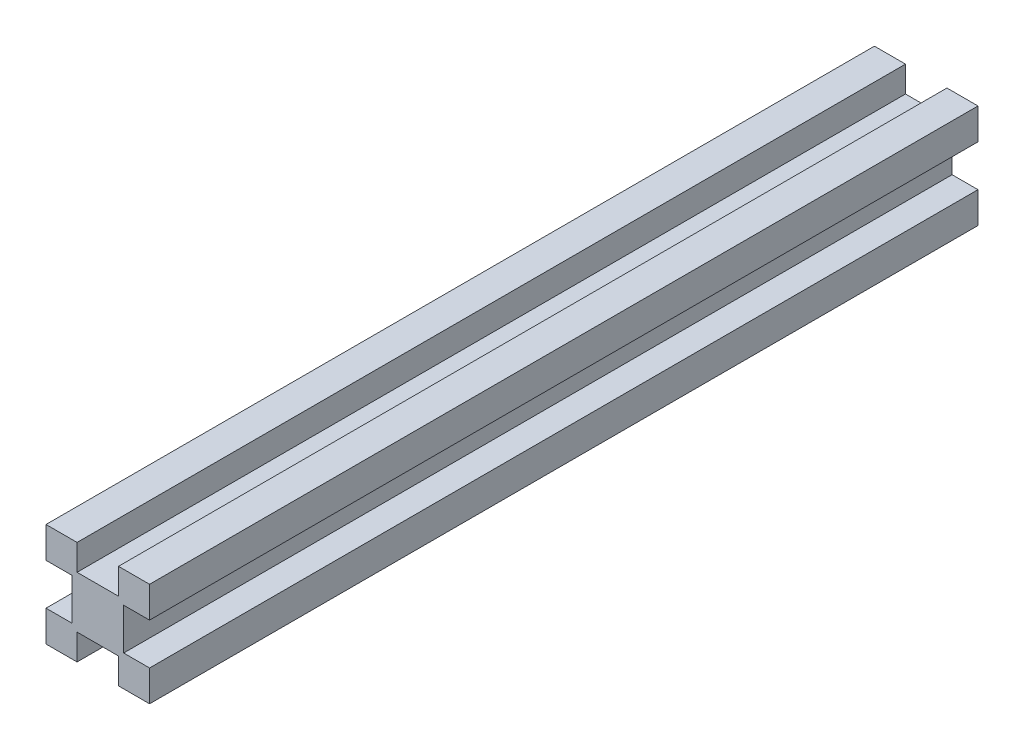
ISO-10303-21;
HEADER;
FILE_DESCRIPTION(('STEP AP214'),'2;1');
FILE_NAME('part.step','',(''),(''),'','','');
FILE_SCHEMA(('AUTOMOTIVE_DESIGN { 1 0 10303 214 1 1 1 1 }'));
ENDSEC;
DATA;
#1=APPLICATION_CONTEXT('core data for automotive mechanical design processes');
#2=APPLICATION_PROTOCOL_DEFINITION('international standard','automotive_design',2000,#1);
#3=PRODUCT_CONTEXT('',#1,'mechanical');
#4=PRODUCT('Part','Part','',(#3));
#5=PRODUCT_RELATED_PRODUCT_CATEGORY('part','',(#4));
#6=PRODUCT_DEFINITION_FORMATION('','',#4);
#7=PRODUCT_DEFINITION_CONTEXT('part definition',#1,'design');
#8=PRODUCT_DEFINITION('design','',#6,#7);
#9=PRODUCT_DEFINITION_SHAPE('','',#8);
#10=(LENGTH_UNIT() NAMED_UNIT(*) SI_UNIT(.MILLI.,.METRE.));
#11=(NAMED_UNIT(*) PLANE_ANGLE_UNIT() SI_UNIT($,.RADIAN.));
#12=(NAMED_UNIT(*) SI_UNIT($,.STERADIAN.) SOLID_ANGLE_UNIT());
#13=UNCERTAINTY_MEASURE_WITH_UNIT(LENGTH_MEASURE(1.E-05),#10,'distance_accuracy_value','');
#14=(GEOMETRIC_REPRESENTATION_CONTEXT(3) GLOBAL_UNCERTAINTY_ASSIGNED_CONTEXT((#13)) GLOBAL_UNIT_ASSIGNED_CONTEXT((#10,
#11,#12)) REPRESENTATION_CONTEXT('',''));
#15=CARTESIAN_POINT('',(0.,0.,0.));
#16=DIRECTION('',(0.,0.,1.));
#17=DIRECTION('',(1.,0.,0.));
#18=AXIS2_PLACEMENT_3D('',#15,#16,#17);
#19=CARTESIAN_POINT('',(-3.5325550493546,14.5416666666667,160.));
#20=DIRECTION('',(-1.,0.,0.));
#21=DIRECTION('',(0.,-1.,0.));
#22=AXIS2_PLACEMENT_3D('',#19,#20,#21);
#23=PLANE('',#22);
#24=DIRECTION('',(0.,1.,0.));
#25=VECTOR('',#24,1.);
#26=CARTESIAN_POINT('',(-3.5325550493546,14.5416666666667,0.));
#27=LINE('',#26,#25);
#28=CARTESIAN_POINT('',(-3.5325550493546,-5.45833333333333,0.));
#29=VERTEX_POINT('',#28);
#30=CARTESIAN_POINT('',(-3.5325550493546,0.541666666666671,0.));
#31=VERTEX_POINT('',#30);
#32=EDGE_CURVE('E226',#29,#31,#27,.T.);
#33=ORIENTED_EDGE('',*,*,#32,.T.);
#34=DIRECTION('',(0.,0.,1.));
#35=VECTOR('',#34,1.);
#36=CARTESIAN_POINT('',(-3.5325550493546,0.541666666666671,-160.));
#37=LINE('',#36,#35);
#38=CARTESIAN_POINT('',(-3.5325550493546,0.541666666666671,160.));
#39=VERTEX_POINT('',#38);
#40=EDGE_CURVE('E350',#31,#39,#37,.T.);
#41=ORIENTED_EDGE('',*,*,#40,.T.);
#42=DIRECTION('',(0.,1.,0.));
#43=VECTOR('',#42,1.);
#44=CARTESIAN_POINT('',(-3.5325550493546,14.5416666666667,160.));
#45=LINE('',#44,#43);
#46=CARTESIAN_POINT('',(-3.5325550493546,-5.45833333333333,160.));
#47=VERTEX_POINT('',#46);
#48=EDGE_CURVE('E385',#47,#39,#45,.T.);
#49=ORIENTED_EDGE('',*,*,#48,.F.);
#50=DIRECTION('',(0.,0.,-1.));
#51=VECTOR('',#50,1.);
#52=CARTESIAN_POINT('',(-3.5325550493546,-5.45833333333333,160.));
#53=LINE('',#52,#51);
#54=EDGE_CURVE('E225',#47,#29,#53,.T.);
#55=ORIENTED_EDGE('',*,*,#54,.T.);
#56=EDGE_LOOP('',(#33,#41,#49,#55));
#57=FACE_BOUND('',#56,.T.);
#58=ADVANCED_FACE('F45',(#57),#23,.F.);
#59=CARTESIAN_POINT('',(-23.5325550493546,14.5416666666667,160.));
#60=DIRECTION('',(0.,-1.,0.));
#61=DIRECTION('',(0.,0.,-1.));
#62=AXIS2_PLACEMENT_3D('',#59,#60,#61);
#63=PLANE('',#62);
#64=DIRECTION('',(-1.,0.,0.));
#65=VECTOR('',#64,1.);
#66=CARTESIAN_POINT('',(-23.5325550493546,14.5416666666667,160.));
#67=LINE('',#66,#65);
#68=CARTESIAN_POINT('',(-17.5325550493546,14.5416666666667,160.));
#69=VERTEX_POINT('',#68);
#70=CARTESIAN_POINT('',(-23.5325550493546,14.5416666666667,160.));
#71=VERTEX_POINT('',#70);
#72=EDGE_CURVE('E218',#69,#71,#67,.T.);
#73=ORIENTED_EDGE('',*,*,#72,.F.);
#74=DIRECTION('',(0.,0.,1.));
#75=VECTOR('',#74,1.);
#76=CARTESIAN_POINT('',(-17.5325550493546,14.5416666666667,-160.));
#77=LINE('',#76,#75);
#78=CARTESIAN_POINT('',(-17.5325550493546,14.5416666666667,0.));
#79=VERTEX_POINT('',#78);
#80=EDGE_CURVE('E325',#79,#69,#77,.T.);
#81=ORIENTED_EDGE('',*,*,#80,.F.);
#82=DIRECTION('',(-1.,0.,0.));
#83=VECTOR('',#82,1.);
#84=CARTESIAN_POINT('',(-23.5325550493546,14.5416666666667,0.));
#85=LINE('',#84,#83);
#86=CARTESIAN_POINT('',(-23.5325550493546,14.5416666666667,0.));
#87=VERTEX_POINT('',#86);
#88=EDGE_CURVE('E230',#79,#87,#85,.T.);
#89=ORIENTED_EDGE('',*,*,#88,.T.);
#90=DIRECTION('',(0.,0.,-1.));
#91=VECTOR('',#90,1.);
#92=CARTESIAN_POINT('',(-23.5325550493546,14.5416666666667,160.));
#93=LINE('',#92,#91);
#94=EDGE_CURVE('E252',#71,#87,#93,.T.);
#95=ORIENTED_EDGE('',*,*,#94,.F.);
#96=EDGE_LOOP('',(#73,#81,#89,#95));
#97=FACE_BOUND('',#96,.T.);
#98=ADVANCED_FACE('F418',(#97),#63,.F.);
#99=CARTESIAN_POINT('',(-23.5325550493546,14.5416666666667,160.));
#100=DIRECTION('',(1.,0.,0.));
#101=DIRECTION('',(0.,1.,0.));
#102=AXIS2_PLACEMENT_3D('',#99,#100,#101);
#103=PLANE('',#102);
#104=DIRECTION('',(0.,-1.,0.));
#105=VECTOR('',#104,1.);
#106=CARTESIAN_POINT('',(-23.5325550493546,14.5416666666667,0.));
#107=LINE('',#106,#105);
#108=CARTESIAN_POINT('',(-23.5325550493546,8.54166666666667,0.));
#109=VERTEX_POINT('',#108);
#110=EDGE_CURVE('E237',#87,#109,#107,.T.);
#111=ORIENTED_EDGE('',*,*,#110,.T.);
#112=DIRECTION('',(0.,0.,1.));
#113=VECTOR('',#112,1.);
#114=CARTESIAN_POINT('',(-23.5325550493546,8.54166666666667,-160.));
#115=LINE('',#114,#113);
#116=CARTESIAN_POINT('',(-23.5325550493546,8.54166666666667,160.));
#117=VERTEX_POINT('',#116);
#118=EDGE_CURVE('E308',#109,#117,#115,.T.);
#119=ORIENTED_EDGE('',*,*,#118,.T.);
#120=DIRECTION('',(0.,-1.,0.));
#121=VECTOR('',#120,1.);
#122=CARTESIAN_POINT('',(-23.5325550493546,14.5416666666667,160.));
#123=LINE('',#122,#121);
#124=EDGE_CURVE('E210',#71,#117,#123,.T.);
#125=ORIENTED_EDGE('',*,*,#124,.F.);
#126=ORIENTED_EDGE('',*,*,#94,.T.);
#127=EDGE_LOOP('',(#111,#119,#125,#126));
#128=FACE_BOUND('',#127,.T.);
#129=ADVANCED_FACE('F422',(#128),#103,.F.);
#130=CARTESIAN_POINT('',(-23.5325550493546,-5.45833333333333,160.));
#131=DIRECTION('',(0.,1.,0.));
#132=DIRECTION('',(0.,0.,1.));
#133=AXIS2_PLACEMENT_3D('',#130,#131,#132);
#134=PLANE('',#133);
#135=DIRECTION('',(1.,0.,0.));
#136=VECTOR('',#135,1.);
#137=CARTESIAN_POINT('',(-23.5325550493546,-5.45833333333333,160.));
#138=LINE('',#137,#136);
#139=CARTESIAN_POINT('',(-9.5325550493546,-5.45833333333333,160.));
#140=VERTEX_POINT('',#139);
#141=EDGE_CURVE('E216',#140,#47,#138,.T.);
#142=ORIENTED_EDGE('',*,*,#141,.F.);
#143=DIRECTION('',(0.,0.,1.));
#144=VECTOR('',#143,1.);
#145=CARTESIAN_POINT('',(-9.5325550493546,-5.45833333333333,-160.));
#146=LINE('',#145,#144);
#147=CARTESIAN_POINT('',(-9.5325550493546,-5.45833333333333,0.));
#148=VERTEX_POINT('',#147);
#149=EDGE_CURVE('E371',#148,#140,#146,.T.);
#150=ORIENTED_EDGE('',*,*,#149,.F.);
#151=DIRECTION('',(1.,0.,0.));
#152=VECTOR('',#151,1.);
#153=CARTESIAN_POINT('',(-23.5325550493546,-5.45833333333333,0.));
#154=LINE('',#153,#152);
#155=EDGE_CURVE('E241',#148,#29,#154,.T.);
#156=ORIENTED_EDGE('',*,*,#155,.T.);
#157=ORIENTED_EDGE('',*,*,#54,.F.);
#158=EDGE_LOOP('',(#142,#150,#156,#157));
#159=FACE_BOUND('',#158,.T.);
#160=ADVANCED_FACE('F442',(#159),#134,.F.);
#161=CARTESIAN_POINT('',(-3.5325550493546,8.54166666666667,160.));
#162=VERTEX_POINT('',#161);
#163=CARTESIAN_POINT('',(-3.5325550493546,14.5416666666667,160.));
#164=VERTEX_POINT('',#163);
#165=EDGE_CURVE('E246',#162,#164,#45,.T.);
#166=ORIENTED_EDGE('',*,*,#165,.F.);
#167=DIRECTION('',(0.,0.,1.));
#168=VECTOR('',#167,1.);
#169=CARTESIAN_POINT('',(-3.5325550493546,8.54166666666667,-160.));
#170=LINE('',#169,#168);
#171=CARTESIAN_POINT('',(-3.5325550493546,8.54166666666667,0.));
#172=VERTEX_POINT('',#171);
#173=EDGE_CURVE('E341',#172,#162,#170,.T.);
#174=ORIENTED_EDGE('',*,*,#173,.F.);
#175=CARTESIAN_POINT('',(-3.5325550493546,14.5416666666667,0.));
#176=VERTEX_POINT('',#175);
#177=EDGE_CURVE('E231',#172,#176,#27,.T.);
#178=ORIENTED_EDGE('',*,*,#177,.T.);
#179=DIRECTION('',(0.,0.,-1.));
#180=VECTOR('',#179,1.);
#181=CARTESIAN_POINT('',(-3.5325550493546,14.5416666666667,160.));
#182=LINE('',#181,#180);
#183=EDGE_CURVE('E256',#164,#176,#182,.T.);
#184=ORIENTED_EDGE('',*,*,#183,.F.);
#185=EDGE_LOOP('',(#166,#174,#178,#184));
#186=FACE_BOUND('',#185,.T.);
#187=ADVANCED_FACE('F47',(#186),#23,.F.);
#188=CARTESIAN_POINT('',(-9.5325550493546,14.5416666666667,0.));
#189=VERTEX_POINT('',#188);
#190=EDGE_CURVE('E232',#176,#189,#85,.T.);
#191=ORIENTED_EDGE('',*,*,#190,.T.);
#192=DIRECTION('',(0.,0.,1.));
#193=VECTOR('',#192,1.);
#194=CARTESIAN_POINT('',(-9.5325550493546,14.5416666666667,-160.));
#195=LINE('',#194,#193);
#196=CARTESIAN_POINT('',(-9.5325550493546,14.5416666666667,160.));
#197=VERTEX_POINT('',#196);
#198=EDGE_CURVE('E321',#189,#197,#195,.T.);
#199=ORIENTED_EDGE('',*,*,#198,.T.);
#200=EDGE_CURVE('E211',#164,#197,#67,.T.);
#201=ORIENTED_EDGE('',*,*,#200,.F.);
#202=ORIENTED_EDGE('',*,*,#183,.T.);
#203=EDGE_LOOP('',(#191,#199,#201,#202));
#204=FACE_BOUND('',#203,.T.);
#205=ADVANCED_FACE('F401',(#204),#63,.F.);
#206=CARTESIAN_POINT('',(-23.5325550493546,0.541666666666668,160.));
#207=VERTEX_POINT('',#206);
#208=CARTESIAN_POINT('',(-23.5325550493546,-5.45833333333333,160.));
#209=VERTEX_POINT('',#208);
#210=EDGE_CURVE('E198',#207,#209,#123,.T.);
#211=ORIENTED_EDGE('',*,*,#210,.F.);
#212=DIRECTION('',(0.,0.,1.));
#213=VECTOR('',#212,1.);
#214=CARTESIAN_POINT('',(-23.5325550493546,0.541666666666668,-160.));
#215=LINE('',#214,#213);
#216=CARTESIAN_POINT('',(-23.5325550493546,0.541666666666668,0.));
#217=VERTEX_POINT('',#216);
#218=EDGE_CURVE('E181',#217,#207,#215,.T.);
#219=ORIENTED_EDGE('',*,*,#218,.F.);
#220=CARTESIAN_POINT('',(-23.5325550493546,-5.45833333333333,0.));
#221=VERTEX_POINT('',#220);
#222=EDGE_CURVE('E236',#217,#221,#107,.T.);
#223=ORIENTED_EDGE('',*,*,#222,.T.);
#224=DIRECTION('',(0.,0.,-1.));
#225=VECTOR('',#224,1.);
#226=CARTESIAN_POINT('',(-23.5325550493546,-5.45833333333333,160.));
#227=LINE('',#226,#225);
#228=EDGE_CURVE('E207',#209,#221,#227,.T.);
#229=ORIENTED_EDGE('',*,*,#228,.F.);
#230=EDGE_LOOP('',(#211,#219,#223,#229));
#231=FACE_BOUND('',#230,.T.);
#232=ADVANCED_FACE('F205',(#231),#103,.F.);
#233=CARTESIAN_POINT('',(-17.5325550493546,-5.45833333333333,0.));
#234=VERTEX_POINT('',#233);
#235=EDGE_CURVE('E242',#221,#234,#154,.T.);
#236=ORIENTED_EDGE('',*,*,#235,.T.);
#237=DIRECTION('',(0.,0.,1.));
#238=VECTOR('',#237,1.);
#239=CARTESIAN_POINT('',(-17.5325550493546,-5.45833333333333,-160.));
#240=LINE('',#239,#238);
#241=CARTESIAN_POINT('',(-17.5325550493546,-5.45833333333333,160.));
#242=VERTEX_POINT('',#241);
#243=EDGE_CURVE('E367',#234,#242,#240,.T.);
#244=ORIENTED_EDGE('',*,*,#243,.T.);
#245=EDGE_CURVE('E222',#209,#242,#138,.T.);
#246=ORIENTED_EDGE('',*,*,#245,.F.);
#247=ORIENTED_EDGE('',*,*,#228,.T.);
#248=EDGE_LOOP('',(#236,#244,#246,#247));
#249=FACE_BOUND('',#248,.T.);
#250=ADVANCED_FACE('F449',(#249),#134,.F.);
#251=CARTESIAN_POINT('',(0.,0.,160.));
#252=DIRECTION('',(0.,0.,1.));
#253=DIRECTION('',(1.,0.,0.));
#254=AXIS2_PLACEMENT_3D('',#251,#252,#253);
#255=PLANE('',#254);
#256=DIRECTION('',(-1.,0.,0.));
#257=VECTOR('',#256,1.);
#258=CARTESIAN_POINT('',(-23.5325550493546,8.54166666666667,160.));
#259=LINE('',#258,#257);
#260=CARTESIAN_POINT('',(-18.5325550493546,8.54166666666667,160.));
#261=VERTEX_POINT('',#260);
#262=EDGE_CURVE('E192',#261,#117,#259,.T.);
#263=ORIENTED_EDGE('',*,*,#262,.F.);
#264=DIRECTION('',(0.,1.,0.));
#265=VECTOR('',#264,1.);
#266=CARTESIAN_POINT('',(-18.5325550493546,8.54166666666667,160.));
#267=LINE('',#266,#265);
#268=CARTESIAN_POINT('',(-18.5325550493546,0.541666666666668,160.));
#269=VERTEX_POINT('',#268);
#270=EDGE_CURVE('E201',#269,#261,#267,.T.);
#271=ORIENTED_EDGE('',*,*,#270,.F.);
#272=DIRECTION('',(1.,0.,0.));
#273=VECTOR('',#272,1.);
#274=CARTESIAN_POINT('',(-18.5325550493546,0.541666666666668,160.));
#275=LINE('',#274,#273);
#276=EDGE_CURVE('E184',#207,#269,#275,.T.);
#277=ORIENTED_EDGE('',*,*,#276,.F.);
#278=ORIENTED_EDGE('',*,*,#210,.T.);
#279=ORIENTED_EDGE('',*,*,#245,.T.);
#280=DIRECTION('',(0.,-1.,0.));
#281=VECTOR('',#280,1.);
#282=CARTESIAN_POINT('',(-17.5325550493546,-0.458333333333331,160.));
#283=LINE('',#282,#281);
#284=CARTESIAN_POINT('',(-17.5325550493546,-0.458333333333331,160.));
#285=VERTEX_POINT('',#284);
#286=EDGE_CURVE('E380',#285,#242,#283,.T.);
#287=ORIENTED_EDGE('',*,*,#286,.F.);
#288=DIRECTION('',(-1.,0.,0.));
#289=VECTOR('',#288,1.);
#290=CARTESIAN_POINT('',(-13.5325550493546,-0.458333333333328,160.));
#291=LINE('',#290,#289);
#292=CARTESIAN_POINT('',(-9.5325550493546,-0.458333333333333,160.));
#293=VERTEX_POINT('',#292);
#294=EDGE_CURVE('E354',#293,#285,#291,.T.);
#295=ORIENTED_EDGE('',*,*,#294,.F.);
#296=DIRECTION('',(0.,1.,0.));
#297=VECTOR('',#296,1.);
#298=CARTESIAN_POINT('',(-9.5325550493546,-0.458333333333333,160.));
#299=LINE('',#298,#297);
#300=EDGE_CURVE('E366',#140,#293,#299,.T.);
#301=ORIENTED_EDGE('',*,*,#300,.F.);
#302=ORIENTED_EDGE('',*,*,#141,.T.);
#303=ORIENTED_EDGE('',*,*,#48,.T.);
#304=DIRECTION('',(1.,0.,0.));
#305=VECTOR('',#304,1.);
#306=CARTESIAN_POINT('',(-8.5325550493546,0.541666666666668,160.));
#307=LINE('',#306,#305);
#308=CARTESIAN_POINT('',(-8.5325550493546,0.541666666666668,160.));
#309=VERTEX_POINT('',#308);
#310=EDGE_CURVE('E344',#309,#39,#307,.T.);
#311=ORIENTED_EDGE('',*,*,#310,.F.);
#312=DIRECTION('',(0.,-1.,0.));
#313=VECTOR('',#312,1.);
#314=CARTESIAN_POINT('',(-8.5325550493546,8.54166666666667,160.));
#315=LINE('',#314,#313);
#316=CARTESIAN_POINT('',(-8.5325550493546,8.54166666666667,160.));
#317=VERTEX_POINT('',#316);
#318=EDGE_CURVE('E357',#317,#309,#315,.T.);
#319=ORIENTED_EDGE('',*,*,#318,.F.);
#320=DIRECTION('',(-1.,0.,0.));
#321=VECTOR('',#320,1.);
#322=CARTESIAN_POINT('',(-3.5325550493546,8.54166666666667,160.));
#323=LINE('',#322,#321);
#324=EDGE_CURVE('E331',#162,#317,#323,.T.);
#325=ORIENTED_EDGE('',*,*,#324,.F.);
#326=ORIENTED_EDGE('',*,*,#165,.T.);
#327=ORIENTED_EDGE('',*,*,#200,.T.);
#328=DIRECTION('',(0.,1.,0.));
#329=VECTOR('',#328,1.);
#330=CARTESIAN_POINT('',(-9.5325550493546,9.54166666666667,160.));
#331=LINE('',#330,#329);
#332=CARTESIAN_POINT('',(-9.5325550493546,9.54166666666667,160.));
#333=VERTEX_POINT('',#332);
#334=EDGE_CURVE('E203',#333,#197,#331,.T.);
#335=ORIENTED_EDGE('',*,*,#334,.F.);
#336=DIRECTION('',(1.,0.,0.));
#337=VECTOR('',#336,1.);
#338=CARTESIAN_POINT('',(-13.5325550493546,9.54166666666667,160.));
#339=LINE('',#338,#337);
#340=CARTESIAN_POINT('',(-17.5325550493546,9.54166666666667,160.));
#341=VERTEX_POINT('',#340);
#342=EDGE_CURVE('E320',#341,#333,#339,.T.);
#343=ORIENTED_EDGE('',*,*,#342,.F.);
#344=DIRECTION('',(0.,-1.,0.));
#345=VECTOR('',#344,1.);
#346=CARTESIAN_POINT('',(-17.5325550493546,9.54166666666667,160.));
#347=LINE('',#346,#345);
#348=EDGE_CURVE('E335',#69,#341,#347,.T.);
#349=ORIENTED_EDGE('',*,*,#348,.F.);
#350=ORIENTED_EDGE('',*,*,#72,.T.);
#351=ORIENTED_EDGE('',*,*,#124,.T.);
#352=EDGE_LOOP('',(#263,#271,#277,#278,#279,#287,#295,#301,#302,#303,#311,#319,#325,#326,#327,
#335,#343,#349,#350,#351));
#353=FACE_BOUND('',#352,.T.);
#354=ADVANCED_FACE('F196',(#353),#255,.T.);
#355=CARTESIAN_POINT('',(0.,0.,0.));
#356=DIRECTION('',(0.,0.,1.));
#357=DIRECTION('',(1.,0.,0.));
#358=AXIS2_PLACEMENT_3D('',#355,#356,#357);
#359=PLANE('',#358);
#360=DIRECTION('',(0.,1.,0.));
#361=VECTOR('',#360,1.);
#362=CARTESIAN_POINT('',(-18.5325550493546,0.,0.));
#363=LINE('',#362,#361);
#364=CARTESIAN_POINT('',(-18.5325550493546,0.541666666666668,0.));
#365=VERTEX_POINT('',#364);
#366=CARTESIAN_POINT('',(-18.5325550493546,8.54166666666667,0.));
#367=VERTEX_POINT('',#366);
#368=EDGE_CURVE('E54',#365,#367,#363,.T.);
#369=ORIENTED_EDGE('',*,*,#368,.T.);
#370=DIRECTION('',(-1.,0.,0.));
#371=VECTOR('',#370,1.);
#372=CARTESIAN_POINT('',(0.,8.54166666666667,0.));
#373=LINE('',#372,#371);
#374=EDGE_CURVE('E11',#367,#109,#373,.T.);
#375=ORIENTED_EDGE('',*,*,#374,.T.);
#376=ORIENTED_EDGE('',*,*,#110,.F.);
#377=ORIENTED_EDGE('',*,*,#88,.F.);
#378=DIRECTION('',(0.,-1.,0.));
#379=VECTOR('',#378,1.);
#380=CARTESIAN_POINT('',(-17.5325550493546,0.,0.));
#381=LINE('',#380,#379);
#382=CARTESIAN_POINT('',(-17.5325550493546,9.54166666666667,0.));
#383=VERTEX_POINT('',#382);
#384=EDGE_CURVE('E292',#79,#383,#381,.T.);
#385=ORIENTED_EDGE('',*,*,#384,.T.);
#386=DIRECTION('',(1.,0.,0.));
#387=VECTOR('',#386,1.);
#388=CARTESIAN_POINT('',(0.,9.54166666666666,0.));
#389=LINE('',#388,#387);
#390=CARTESIAN_POINT('',(-9.5325550493546,9.54166666666667,0.));
#391=VERTEX_POINT('',#390);
#392=EDGE_CURVE('E288',#383,#391,#389,.T.);
#393=ORIENTED_EDGE('',*,*,#392,.T.);
#394=DIRECTION('',(0.,1.,0.));
#395=VECTOR('',#394,1.);
#396=CARTESIAN_POINT('',(-9.5325550493546,0.,0.));
#397=LINE('',#396,#395);
#398=EDGE_CURVE('E284',#391,#189,#397,.T.);
#399=ORIENTED_EDGE('',*,*,#398,.T.);
#400=ORIENTED_EDGE('',*,*,#190,.F.);
#401=ORIENTED_EDGE('',*,*,#177,.F.);
#402=DIRECTION('',(-1.,0.,0.));
#403=VECTOR('',#402,1.);
#404=CARTESIAN_POINT('',(0.,8.54166666666668,0.));
#405=LINE('',#404,#403);
#406=CARTESIAN_POINT('',(-8.5325550493546,8.54166666666667,0.));
#407=VERTEX_POINT('',#406);
#408=EDGE_CURVE('E272',#172,#407,#405,.T.);
#409=ORIENTED_EDGE('',*,*,#408,.T.);
#410=DIRECTION('',(0.,-1.,0.));
#411=VECTOR('',#410,1.);
#412=CARTESIAN_POINT('',(-8.5325550493546,0.,0.));
#413=LINE('',#412,#411);
#414=CARTESIAN_POINT('',(-8.5325550493546,0.541666666666668,0.));
#415=VERTEX_POINT('',#414);
#416=EDGE_CURVE('E276',#407,#415,#413,.T.);
#417=ORIENTED_EDGE('',*,*,#416,.T.);
#418=DIRECTION('',(1.,0.,0.));
#419=VECTOR('',#418,1.);
#420=CARTESIAN_POINT('',(0.,0.541666666666673,0.));
#421=LINE('',#420,#419);
#422=EDGE_CURVE('E280',#415,#31,#421,.T.);
#423=ORIENTED_EDGE('',*,*,#422,.T.);
#424=ORIENTED_EDGE('',*,*,#32,.F.);
#425=ORIENTED_EDGE('',*,*,#155,.F.);
#426=DIRECTION('',(0.,1.,0.));
#427=VECTOR('',#426,1.);
#428=CARTESIAN_POINT('',(-9.5325550493546,0.,0.));
#429=LINE('',#428,#427);
#430=CARTESIAN_POINT('',(-9.5325550493546,-0.458333333333333,0.));
#431=VERTEX_POINT('',#430);
#432=EDGE_CURVE('E268',#148,#431,#429,.T.);
#433=ORIENTED_EDGE('',*,*,#432,.T.);
#434=DIRECTION('',(-1.,0.,0.));
#435=VECTOR('',#434,1.);
#436=CARTESIAN_POINT('',(0.,-0.458333333333316,0.));
#437=LINE('',#436,#435);
#438=CARTESIAN_POINT('',(-17.5325550493546,-0.458333333333331,0.));
#439=VERTEX_POINT('',#438);
#440=EDGE_CURVE('E260',#431,#439,#437,.T.);
#441=ORIENTED_EDGE('',*,*,#440,.T.);
#442=DIRECTION('',(0.,-1.,0.));
#443=VECTOR('',#442,1.);
#444=CARTESIAN_POINT('',(-17.5325550493546,0.,0.));
#445=LINE('',#444,#443);
#446=EDGE_CURVE('E264',#439,#234,#445,.T.);
#447=ORIENTED_EDGE('',*,*,#446,.T.);
#448=ORIENTED_EDGE('',*,*,#235,.F.);
#449=ORIENTED_EDGE('',*,*,#222,.F.);
#450=DIRECTION('',(1.,0.,0.));
#451=VECTOR('',#450,1.);
#452=CARTESIAN_POINT('',(0.,0.541666666666671,0.));
#453=LINE('',#452,#451);
#454=EDGE_CURVE('E187',#217,#365,#453,.T.);
#455=ORIENTED_EDGE('',*,*,#454,.T.);
#456=EDGE_LOOP('',(#369,#375,#376,#377,#385,#393,#399,#400,#401,#409,#417,#423,#424,#425,#433,
#441,#447,#448,#449,#455));
#457=FACE_BOUND('',#456,.T.);
#458=ADVANCED_FACE('F300',(#457),#359,.F.);
#459=CARTESIAN_POINT('',(-9.5325550493546,-0.458333333333333,-160.));
#460=DIRECTION('',(1.,0.,0.));
#461=DIRECTION('',(0.,0.,-1.));
#462=AXIS2_PLACEMENT_3D('',#459,#460,#461);
#463=PLANE('',#462);
#464=ORIENTED_EDGE('',*,*,#149,.T.);
#465=ORIENTED_EDGE('',*,*,#300,.T.);
#466=DIRECTION('',(0.,0.,1.));
#467=VECTOR('',#466,1.);
#468=CARTESIAN_POINT('',(-9.5325550493546,-0.458333333333333,-160.));
#469=LINE('',#468,#467);
#470=EDGE_CURVE('E374',#431,#293,#469,.T.);
#471=ORIENTED_EDGE('',*,*,#470,.F.);
#472=ORIENTED_EDGE('',*,*,#432,.F.);
#473=EDGE_LOOP('',(#464,#465,#471,#472));
#474=FACE_BOUND('',#473,.T.);
#475=ADVANCED_FACE('F474',(#474),#463,.F.);
#476=CARTESIAN_POINT('',(-17.5325550493546,-0.458333333333331,-160.));
#477=DIRECTION('',(-1.,0.,0.));
#478=DIRECTION('',(0.,0.,1.));
#479=AXIS2_PLACEMENT_3D('',#476,#477,#478);
#480=PLANE('',#479);
#481=DIRECTION('',(0.,0.,1.));
#482=VECTOR('',#481,1.);
#483=CARTESIAN_POINT('',(-17.5325550493546,-0.458333333333331,-160.));
#484=LINE('',#483,#482);
#485=EDGE_CURVE('E363',#439,#285,#484,.T.);
#486=ORIENTED_EDGE('',*,*,#485,.T.);
#487=ORIENTED_EDGE('',*,*,#286,.T.);
#488=ORIENTED_EDGE('',*,*,#243,.F.);
#489=ORIENTED_EDGE('',*,*,#446,.F.);
#490=EDGE_LOOP('',(#486,#487,#488,#489));
#491=FACE_BOUND('',#490,.T.);
#492=ADVANCED_FACE('F466',(#491),#480,.F.);
#493=CARTESIAN_POINT('',(-13.5325550493546,-0.458333333333328,-160.));
#494=DIRECTION('',(0.,1.,0.));
#495=DIRECTION('',(-1.,0.,0.));
#496=AXIS2_PLACEMENT_3D('',#493,#494,#495);
#497=PLANE('',#496);
#498=ORIENTED_EDGE('',*,*,#470,.T.);
#499=ORIENTED_EDGE('',*,*,#294,.T.);
#500=ORIENTED_EDGE('',*,*,#485,.F.);
#501=ORIENTED_EDGE('',*,*,#440,.F.);
#502=EDGE_LOOP('',(#498,#499,#500,#501));
#503=FACE_BOUND('',#502,.T.);
#504=ADVANCED_FACE('F471',(#503),#497,.F.);
#505=CARTESIAN_POINT('',(-8.5325550493546,0.541666666666668,-160.));
#506=DIRECTION('',(0.,-1.,0.));
#507=DIRECTION('',(1.,0.,0.));
#508=AXIS2_PLACEMENT_3D('',#505,#506,#507);
#509=PLANE('',#508);
#510=DIRECTION('',(0.,0.,1.));
#511=VECTOR('',#510,1.);
#512=CARTESIAN_POINT('',(-8.5325550493546,0.541666666666668,-160.));
#513=LINE('',#512,#511);
#514=EDGE_CURVE('E347',#415,#309,#513,.T.);
#515=ORIENTED_EDGE('',*,*,#514,.T.);
#516=ORIENTED_EDGE('',*,*,#310,.T.);
#517=ORIENTED_EDGE('',*,*,#40,.F.);
#518=ORIENTED_EDGE('',*,*,#422,.F.);
#519=EDGE_LOOP('',(#515,#516,#517,#518));
#520=FACE_BOUND('',#519,.T.);
#521=ADVANCED_FACE('F483',(#520),#509,.F.);
#522=CARTESIAN_POINT('',(-8.5325550493546,8.54166666666667,-160.));
#523=DIRECTION('',(-1.,0.,0.));
#524=DIRECTION('',(0.,-1.,0.));
#525=AXIS2_PLACEMENT_3D('',#522,#523,#524);
#526=PLANE('',#525);
#527=DIRECTION('',(0.,0.,1.));
#528=VECTOR('',#527,1.);
#529=CARTESIAN_POINT('',(-8.5325550493546,8.54166666666667,-160.));
#530=LINE('',#529,#528);
#531=EDGE_CURVE('E69',#407,#317,#530,.T.);
#532=ORIENTED_EDGE('',*,*,#531,.T.);
#533=ORIENTED_EDGE('',*,*,#318,.T.);
#534=ORIENTED_EDGE('',*,*,#514,.F.);
#535=ORIENTED_EDGE('',*,*,#416,.F.);
#536=EDGE_LOOP('',(#532,#533,#534,#535));
#537=FACE_BOUND('',#536,.T.);
#538=ADVANCED_FACE('F486',(#537),#526,.F.);
#539=CARTESIAN_POINT('',(-3.5325550493546,8.54166666666667,-160.));
#540=DIRECTION('',(0.,1.,0.));
#541=DIRECTION('',(-1.,0.,0.));
#542=AXIS2_PLACEMENT_3D('',#539,#540,#541);
#543=PLANE('',#542);
#544=ORIENTED_EDGE('',*,*,#173,.T.);
#545=ORIENTED_EDGE('',*,*,#324,.T.);
#546=ORIENTED_EDGE('',*,*,#531,.F.);
#547=ORIENTED_EDGE('',*,*,#408,.F.);
#548=EDGE_LOOP('',(#544,#545,#546,#547));
#549=FACE_BOUND('',#548,.T.);
#550=ADVANCED_FACE('F487',(#549),#543,.F.);
#551=CARTESIAN_POINT('',(-13.5325550493546,9.54166666666667,-160.));
#552=DIRECTION('',(0.,-1.,0.));
#553=DIRECTION('',(1.,0.,0.));
#554=AXIS2_PLACEMENT_3D('',#551,#552,#553);
#555=PLANE('',#554);
#556=DIRECTION('',(0.,0.,1.));
#557=VECTOR('',#556,1.);
#558=CARTESIAN_POINT('',(-17.5325550493546,9.54166666666667,-160.));
#559=LINE('',#558,#557);
#560=EDGE_CURVE('E328',#383,#341,#559,.T.);
#561=ORIENTED_EDGE('',*,*,#560,.T.);
#562=ORIENTED_EDGE('',*,*,#342,.T.);
#563=DIRECTION('',(0.,0.,1.));
#564=VECTOR('',#563,1.);
#565=CARTESIAN_POINT('',(-9.5325550493546,9.54166666666667,-160.));
#566=LINE('',#565,#564);
#567=EDGE_CURVE('E317',#391,#333,#566,.T.);
#568=ORIENTED_EDGE('',*,*,#567,.F.);
#569=ORIENTED_EDGE('',*,*,#392,.F.);
#570=EDGE_LOOP('',(#561,#562,#568,#569));
#571=FACE_BOUND('',#570,.T.);
#572=ADVANCED_FACE('F409',(#571),#555,.F.);
#573=CARTESIAN_POINT('',(-17.5325550493546,9.54166666666667,-160.));
#574=DIRECTION('',(-1.,0.,0.));
#575=DIRECTION('',(0.,0.,1.));
#576=AXIS2_PLACEMENT_3D('',#573,#574,#575);
#577=PLANE('',#576);
#578=ORIENTED_EDGE('',*,*,#80,.T.);
#579=ORIENTED_EDGE('',*,*,#348,.T.);
#580=ORIENTED_EDGE('',*,*,#560,.F.);
#581=ORIENTED_EDGE('',*,*,#384,.F.);
#582=EDGE_LOOP('',(#578,#579,#580,#581));
#583=FACE_BOUND('',#582,.T.);
#584=ADVANCED_FACE('F434',(#583),#577,.F.);
#585=CARTESIAN_POINT('',(-9.5325550493546,9.54166666666667,-160.));
#586=DIRECTION('',(1.,0.,0.));
#587=DIRECTION('',(0.,0.,-1.));
#588=AXIS2_PLACEMENT_3D('',#585,#586,#587);
#589=PLANE('',#588);
#590=ORIENTED_EDGE('',*,*,#567,.T.);
#591=ORIENTED_EDGE('',*,*,#334,.T.);
#592=ORIENTED_EDGE('',*,*,#198,.F.);
#593=ORIENTED_EDGE('',*,*,#398,.F.);
#594=EDGE_LOOP('',(#590,#591,#592,#593));
#595=FACE_BOUND('',#594,.T.);
#596=ADVANCED_FACE('F407',(#595),#589,.F.);
#597=CARTESIAN_POINT('',(-23.5325550493546,8.54166666666667,-160.));
#598=DIRECTION('',(0.,1.,0.));
#599=DIRECTION('',(0.,0.,1.));
#600=AXIS2_PLACEMENT_3D('',#597,#598,#599);
#601=PLANE('',#600);
#602=DIRECTION('',(0.,0.,1.));
#603=VECTOR('',#602,1.);
#604=CARTESIAN_POINT('',(-18.5325550493546,8.54166666666667,-160.));
#605=LINE('',#604,#603);
#606=EDGE_CURVE('E305',#367,#261,#605,.T.);
#607=ORIENTED_EDGE('',*,*,#606,.T.);
#608=ORIENTED_EDGE('',*,*,#262,.T.);
#609=ORIENTED_EDGE('',*,*,#118,.F.);
#610=ORIENTED_EDGE('',*,*,#374,.F.);
#611=EDGE_LOOP('',(#607,#608,#609,#610));
#612=FACE_BOUND('',#611,.T.);
#613=ADVANCED_FACE('F426',(#612),#601,.F.);
#614=CARTESIAN_POINT('',(-18.5325550493546,8.54166666666667,-160.));
#615=DIRECTION('',(1.,0.,0.));
#616=DIRECTION('',(0.,0.,-1.));
#617=AXIS2_PLACEMENT_3D('',#614,#615,#616);
#618=PLANE('',#617);
#619=DIRECTION('',(0.,0.,1.));
#620=VECTOR('',#619,1.);
#621=CARTESIAN_POINT('',(-18.5325550493546,0.541666666666668,-160.));
#622=LINE('',#621,#620);
#623=EDGE_CURVE('E61',#365,#269,#622,.T.);
#624=ORIENTED_EDGE('',*,*,#623,.T.);
#625=ORIENTED_EDGE('',*,*,#270,.T.);
#626=ORIENTED_EDGE('',*,*,#606,.F.);
#627=ORIENTED_EDGE('',*,*,#368,.F.);
#628=EDGE_LOOP('',(#624,#625,#626,#627));
#629=FACE_BOUND('',#628,.T.);
#630=ADVANCED_FACE('F304',(#629),#618,.F.);
#631=CARTESIAN_POINT('',(-18.5325550493546,0.541666666666668,-160.));
#632=DIRECTION('',(0.,-1.,0.));
#633=DIRECTION('',(1.,0.,0.));
#634=AXIS2_PLACEMENT_3D('',#631,#632,#633);
#635=PLANE('',#634);
#636=ORIENTED_EDGE('',*,*,#218,.T.);
#637=ORIENTED_EDGE('',*,*,#276,.T.);
#638=ORIENTED_EDGE('',*,*,#623,.F.);
#639=ORIENTED_EDGE('',*,*,#454,.F.);
#640=EDGE_LOOP('',(#636,#637,#638,#639));
#641=FACE_BOUND('',#640,.T.);
#642=ADVANCED_FACE('F183',(#641),#635,.F.);
#643=CLOSED_SHELL('',(#58,#98,#129,#160,#187,#205,#232,#250,#354,#458,#475,#492,#504,#521,#538,
#550,#572,#584,#596,#613,#630,#642));
#644=MANIFOLD_SOLID_BREP('B2',#643);
#645=ADVANCED_BREP_SHAPE_REPRESENTATION('',(#18,#644),#14);
#646=SHAPE_DEFINITION_REPRESENTATION(#9,#645);
ENDSEC;
END-ISO-10303-21;
